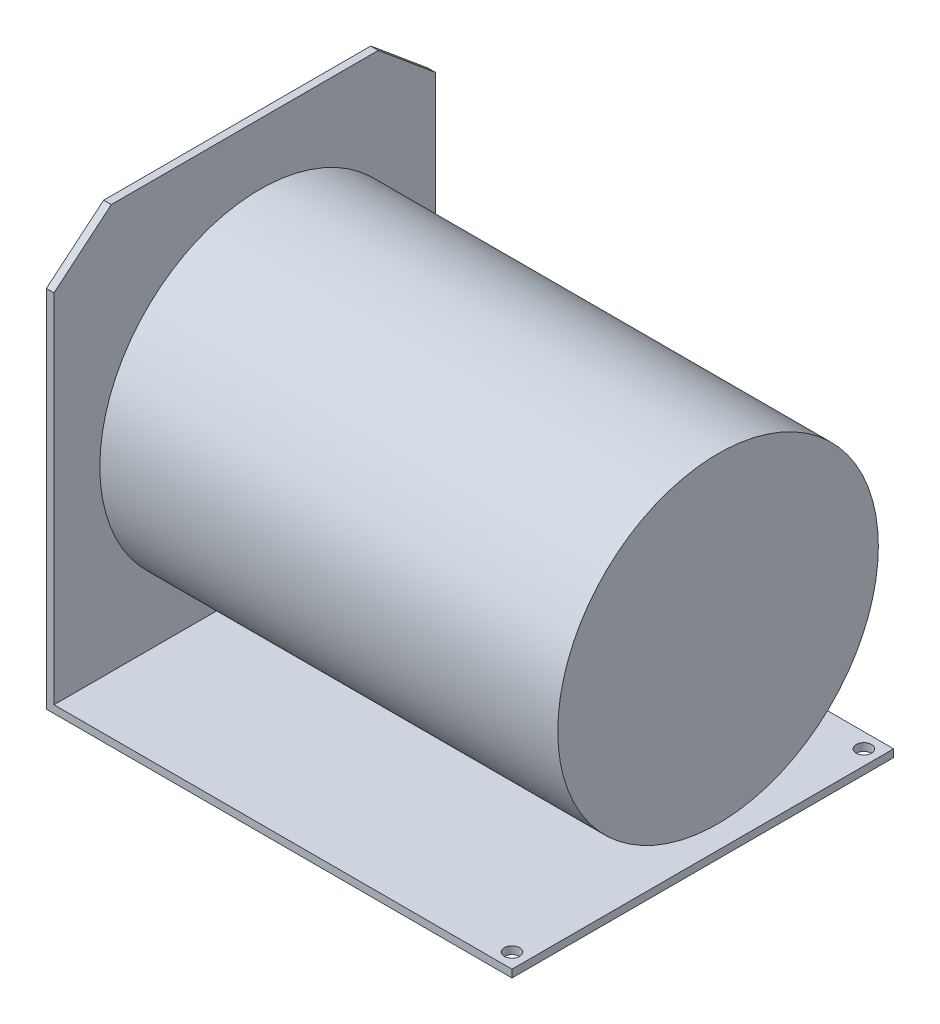
ISO-10303-21;
HEADER;
FILE_DESCRIPTION(('STEP AP214'),'2;1');
FILE_NAME('part.step','',(''),(''),'','','');
FILE_SCHEMA(('AUTOMOTIVE_DESIGN { 1 0 10303 214 1 1 1 1 }'));
ENDSEC;
DATA;
#1=APPLICATION_CONTEXT('core data for automotive mechanical design processes');
#2=APPLICATION_PROTOCOL_DEFINITION('international standard','automotive_design',2000,#1);
#3=PRODUCT_CONTEXT('',#1,'mechanical');
#4=PRODUCT('Part','Part','',(#3));
#5=PRODUCT_RELATED_PRODUCT_CATEGORY('part','',(#4));
#6=PRODUCT_DEFINITION_FORMATION('','',#4);
#7=PRODUCT_DEFINITION_CONTEXT('part definition',#1,'design');
#8=PRODUCT_DEFINITION('design','',#6,#7);
#9=PRODUCT_DEFINITION_SHAPE('','',#8);
#10=(LENGTH_UNIT() NAMED_UNIT(*) SI_UNIT(.MILLI.,.METRE.));
#11=(NAMED_UNIT(*) PLANE_ANGLE_UNIT() SI_UNIT($,.RADIAN.));
#12=(NAMED_UNIT(*) SI_UNIT($,.STERADIAN.) SOLID_ANGLE_UNIT());
#13=UNCERTAINTY_MEASURE_WITH_UNIT(LENGTH_MEASURE(1.E-05),#10,'distance_accuracy_value','');
#14=(GEOMETRIC_REPRESENTATION_CONTEXT(3) GLOBAL_UNCERTAINTY_ASSIGNED_CONTEXT((#13)) GLOBAL_UNIT_ASSIGNED_CONTEXT((#10,
#11,#12)) REPRESENTATION_CONTEXT('',''));
#15=CARTESIAN_POINT('',(0.,0.,0.));
#16=DIRECTION('',(0.,0.,1.));
#17=DIRECTION('',(1.,0.,0.));
#18=AXIS2_PLACEMENT_3D('',#15,#16,#17);
#19=CARTESIAN_POINT('',(-1.,0.,0.));
#20=DIRECTION('',(-1.,0.,0.));
#21=DIRECTION('',(0.,0.,1.));
#22=AXIS2_PLACEMENT_3D('',#19,#20,#21);
#23=PLANE('',#22);
#24=DIRECTION('',(0.,-0.640103799439423,-0.768288439287756));
#25=VECTOR('',#24,1.);
#26=CARTESIAN_POINT('',(-1.,12.2697683463885,-10.2226259502822));
#27=LINE('',#26,#25);
#28=CARTESIAN_POINT('',(-1.,13.5,-8.74603300091481));
#29=VERTEX_POINT('',#28);
#30=CARTESIAN_POINT('',(-1.,10.3723614514982,-12.5));
#31=VERTEX_POINT('',#30);
#32=EDGE_CURVE('E129',#29,#31,#27,.T.);
#33=ORIENTED_EDGE('',*,*,#32,.F.);
#34=DIRECTION('',(0.,0.,-1.));
#35=VECTOR('',#34,1.);
#36=CARTESIAN_POINT('',(-1.,13.5,-12.5));
#37=LINE('',#36,#35);
#38=CARTESIAN_POINT('',(-1.,13.5,8.74603300091481));
#39=VERTEX_POINT('',#38);
#40=EDGE_CURVE('E128',#39,#29,#37,.T.);
#41=ORIENTED_EDGE('',*,*,#40,.F.);
#42=DIRECTION('',(0.,-0.640103799439423,0.768288439287756));
#43=VECTOR('',#42,1.);
#44=CARTESIAN_POINT('',(-1.,12.2697683463885,10.2226259502822));
#45=LINE('',#44,#43);
#46=CARTESIAN_POINT('',(-1.,10.3723614514982,12.5));
#47=VERTEX_POINT('',#46);
#48=EDGE_CURVE('E193',#39,#47,#45,.T.);
#49=ORIENTED_EDGE('',*,*,#48,.T.);
#50=DIRECTION('',(0.,1.,0.));
#51=VECTOR('',#50,1.);
#52=CARTESIAN_POINT('',(-1.,13.5,12.5));
#53=LINE('',#52,#51);
#54=CARTESIAN_POINT('',(-1.,-13.,12.5));
#55=VERTEX_POINT('',#54);
#56=EDGE_CURVE('E144',#55,#47,#53,.T.);
#57=ORIENTED_EDGE('',*,*,#56,.F.);
#58=DIRECTION('',(0.,0.,1.));
#59=VECTOR('',#58,1.);
#60=CARTESIAN_POINT('',(-1.,-13.,12.5));
#61=LINE('',#60,#59);
#62=CARTESIAN_POINT('',(-1.,-13.,-12.5));
#63=VERTEX_POINT('',#62);
#64=EDGE_CURVE('E152',#63,#55,#61,.T.);
#65=ORIENTED_EDGE('',*,*,#64,.F.);
#66=DIRECTION('',(0.,-1.,0.));
#67=VECTOR('',#66,1.);
#68=CARTESIAN_POINT('',(-1.,13.5,-12.5));
#69=LINE('',#68,#67);
#70=EDGE_CURVE('E139',#31,#63,#69,.T.);
#71=ORIENTED_EDGE('',*,*,#70,.F.);
#72=EDGE_LOOP('',(#33,#41,#49,#57,#65,#71));
#73=FACE_BOUND('',#72,.T.);
#74=ADVANCED_FACE('F49',(#73),#23,.F.);
#75=CARTESIAN_POINT('',(-1.5,13.5,-12.5));
#76=DIRECTION('',(0.,-1.,0.));
#77=DIRECTION('',(0.,0.,-1.));
#78=AXIS2_PLACEMENT_3D('',#75,#76,#77);
#79=PLANE('',#78);
#80=DIRECTION('',(-1.,0.,0.));
#81=VECTOR('',#80,1.);
#82=CARTESIAN_POINT('',(28.5,13.5,-8.74603300091481));
#83=LINE('',#82,#81);
#84=CARTESIAN_POINT('',(-1.5,13.5,-8.74603300091481));
#85=VERTEX_POINT('',#84);
#86=EDGE_CURVE('E115',#29,#85,#83,.T.);
#87=ORIENTED_EDGE('',*,*,#86,.T.);
#88=DIRECTION('',(0.,0.,-1.));
#89=VECTOR('',#88,1.);
#90=CARTESIAN_POINT('',(-1.5,13.5,-12.5));
#91=LINE('',#90,#89);
#92=CARTESIAN_POINT('',(-1.5,13.5,8.7460330009148));
#93=VERTEX_POINT('',#92);
#94=EDGE_CURVE('E126',#93,#85,#91,.T.);
#95=ORIENTED_EDGE('',*,*,#94,.F.);
#96=DIRECTION('',(-1.,0.,0.));
#97=VECTOR('',#96,1.);
#98=CARTESIAN_POINT('',(28.5,13.5,8.74603300091481));
#99=LINE('',#98,#97);
#100=EDGE_CURVE('E74',#39,#93,#99,.T.);
#101=ORIENTED_EDGE('',*,*,#100,.F.);
#102=ORIENTED_EDGE('',*,*,#40,.T.);
#103=EDGE_LOOP('',(#87,#95,#101,#102));
#104=FACE_BOUND('',#103,.T.);
#105=ADVANCED_FACE('F125',(#104),#79,.F.);
#106=CARTESIAN_POINT('',(-1.5,13.5,-12.5));
#107=DIRECTION('',(0.,0.,1.));
#108=DIRECTION('',(0.,-1.,0.));
#109=AXIS2_PLACEMENT_3D('',#106,#107,#108);
#110=PLANE('',#109);
#111=DIRECTION('',(-1.,0.,0.));
#112=VECTOR('',#111,1.);
#113=CARTESIAN_POINT('',(28.5,10.3723614514982,-12.5));
#114=LINE('',#113,#112);
#115=CARTESIAN_POINT('',(-1.5,10.3723614514982,-12.5));
#116=VERTEX_POINT('',#115);
#117=EDGE_CURVE('E66',#31,#116,#114,.T.);
#118=ORIENTED_EDGE('',*,*,#117,.F.);
#119=ORIENTED_EDGE('',*,*,#70,.T.);
#120=DIRECTION('',(-1.,0.,0.));
#121=VECTOR('',#120,1.);
#122=CARTESIAN_POINT('',(29.,-13.,-12.5));
#123=LINE('',#122,#121);
#124=CARTESIAN_POINT('',(29.,-13.,-12.5));
#125=VERTEX_POINT('',#124);
#126=EDGE_CURVE('E147',#125,#63,#123,.T.);
#127=ORIENTED_EDGE('',*,*,#126,.F.);
#128=DIRECTION('',(0.,1.,0.));
#129=VECTOR('',#128,1.);
#130=CARTESIAN_POINT('',(29.,-13.5,-12.5));
#131=LINE('',#130,#129);
#132=CARTESIAN_POINT('',(29.,-13.5,-12.5));
#133=VERTEX_POINT('',#132);
#134=EDGE_CURVE('E173',#133,#125,#131,.T.);
#135=ORIENTED_EDGE('',*,*,#134,.F.);
#136=DIRECTION('',(1.,0.,0.));
#137=VECTOR('',#136,1.);
#138=CARTESIAN_POINT('',(-1.5,-13.5,-12.5));
#139=LINE('',#138,#137);
#140=CARTESIAN_POINT('',(-1.5,-13.5,-12.5));
#141=VERTEX_POINT('',#140);
#142=EDGE_CURVE('E12',#141,#133,#139,.T.);
#143=ORIENTED_EDGE('',*,*,#142,.F.);
#144=DIRECTION('',(0.,-1.,0.));
#145=VECTOR('',#144,1.);
#146=CARTESIAN_POINT('',(-1.5,13.5,-12.5));
#147=LINE('',#146,#145);
#148=EDGE_CURVE('E134',#116,#141,#147,.T.);
#149=ORIENTED_EDGE('',*,*,#148,.F.);
#150=EDGE_LOOP('',(#118,#119,#127,#135,#143,#149));
#151=FACE_BOUND('',#150,.T.);
#152=ADVANCED_FACE('F188',(#151),#110,.F.);
#153=CARTESIAN_POINT('',(-1.5,0.,0.));
#154=DIRECTION('',(-1.,0.,0.));
#155=DIRECTION('',(0.,0.,1.));
#156=AXIS2_PLACEMENT_3D('',#153,#154,#155);
#157=PLANE('',#156);
#158=CARTESIAN_POINT('',(-1.5,0.,0.));
#159=DIRECTION('',(-1.,0.,0.));
#160=DIRECTION('',(0.,0.,1.));
#161=AXIS2_PLACEMENT_3D('',#158,#159,#160);
#162=CIRCLE('',#161,1.);
#163=CARTESIAN_POINT('',(-1.5,0.,1.));
#164=VERTEX_POINT('',#163);
#165=EDGE_CURVE('E254',#164,#164,#162,.T.);
#166=ORIENTED_EDGE('',*,*,#165,.F.);
#167=EDGE_LOOP('',(#166));
#168=FACE_BOUND('',#167,.T.);
#169=ORIENTED_EDGE('',*,*,#94,.T.);
#170=DIRECTION('',(0.,-0.640103799439422,-0.768288439287756));
#171=VECTOR('',#170,1.);
#172=CARTESIAN_POINT('',(-1.5,13.5,-8.74603300091481));
#173=LINE('',#172,#171);
#174=EDGE_CURVE('E112',#85,#116,#173,.T.);
#175=ORIENTED_EDGE('',*,*,#174,.T.);
#176=ORIENTED_EDGE('',*,*,#148,.T.);
#177=DIRECTION('',(0.,0.,1.));
#178=VECTOR('',#177,1.);
#179=CARTESIAN_POINT('',(-1.5,-13.5,-12.5));
#180=LINE('',#179,#178);
#181=CARTESIAN_POINT('',(-1.5,-13.5,12.5));
#182=VERTEX_POINT('',#181);
#183=EDGE_CURVE('E137',#141,#182,#180,.T.);
#184=ORIENTED_EDGE('',*,*,#183,.T.);
#185=DIRECTION('',(0.,1.,0.));
#186=VECTOR('',#185,1.);
#187=CARTESIAN_POINT('',(-1.5,13.5,12.5));
#188=LINE('',#187,#186);
#189=CARTESIAN_POINT('',(-1.5,10.3723614514982,12.5));
#190=VERTEX_POINT('',#189);
#191=EDGE_CURVE('E135',#182,#190,#188,.T.);
#192=ORIENTED_EDGE('',*,*,#191,.T.);
#193=DIRECTION('',(0.,-0.640103799439422,0.768288439287756));
#194=VECTOR('',#193,1.);
#195=CARTESIAN_POINT('',(-1.5,13.5,8.74603300091481));
#196=LINE('',#195,#194);
#197=EDGE_CURVE('E133',#93,#190,#196,.T.);
#198=ORIENTED_EDGE('',*,*,#197,.F.);
#199=EDGE_LOOP('',(#169,#175,#176,#184,#192,#198));
#200=FACE_BOUND('',#199,.T.);
#201=ADVANCED_FACE('F131',(#168,#200),#157,.T.);
#202=CARTESIAN_POINT('',(-1.5,13.5,12.5));
#203=DIRECTION('',(0.,0.,-1.));
#204=DIRECTION('',(0.,1.,0.));
#205=AXIS2_PLACEMENT_3D('',#202,#203,#204);
#206=PLANE('',#205);
#207=ORIENTED_EDGE('',*,*,#56,.T.);
#208=DIRECTION('',(-1.,0.,0.));
#209=VECTOR('',#208,1.);
#210=CARTESIAN_POINT('',(28.5,10.3723614514982,12.5));
#211=LINE('',#210,#209);
#212=EDGE_CURVE('E197',#47,#190,#211,.T.);
#213=ORIENTED_EDGE('',*,*,#212,.T.);
#214=ORIENTED_EDGE('',*,*,#191,.F.);
#215=DIRECTION('',(1.,0.,0.));
#216=VECTOR('',#215,1.);
#217=CARTESIAN_POINT('',(-1.5,-13.5,12.5));
#218=LINE('',#217,#216);
#219=CARTESIAN_POINT('',(29.,-13.5,12.5));
#220=VERTEX_POINT('',#219);
#221=EDGE_CURVE('E58',#182,#220,#218,.T.);
#222=ORIENTED_EDGE('',*,*,#221,.T.);
#223=DIRECTION('',(0.,-1.,0.));
#224=VECTOR('',#223,1.);
#225=CARTESIAN_POINT('',(29.,-13.5,12.5));
#226=LINE('',#225,#224);
#227=CARTESIAN_POINT('',(29.,-13.,12.5));
#228=VERTEX_POINT('',#227);
#229=EDGE_CURVE('E157',#228,#220,#226,.T.);
#230=ORIENTED_EDGE('',*,*,#229,.F.);
#231=DIRECTION('',(-1.,0.,0.));
#232=VECTOR('',#231,1.);
#233=CARTESIAN_POINT('',(29.,-13.,12.5));
#234=LINE('',#233,#232);
#235=EDGE_CURVE('E176',#228,#55,#234,.T.);
#236=ORIENTED_EDGE('',*,*,#235,.T.);
#237=EDGE_LOOP('',(#207,#213,#214,#222,#230,#236));
#238=FACE_BOUND('',#237,.T.);
#239=ADVANCED_FACE('F51',(#238),#206,.F.);
#240=CARTESIAN_POINT('',(-1.5,-13.5,-12.5));
#241=DIRECTION('',(0.,1.,0.));
#242=DIRECTION('',(0.,0.,1.));
#243=AXIS2_PLACEMENT_3D('',#240,#241,#242);
#244=PLANE('',#243);
#245=CARTESIAN_POINT('',(28.0280498638905,-13.5,-11.5259972458375));
#246=DIRECTION('',(0.,1.,0.));
#247=DIRECTION('',(0.,0.,1.));
#248=AXIS2_PLACEMENT_3D('',#245,#246,#247);
#249=CIRCLE('',#248,0.499999999999999);
#250=CARTESIAN_POINT('',(28.0280498638905,-13.5,-11.0259972458375));
#251=VERTEX_POINT('',#250);
#252=EDGE_CURVE('E164',#251,#251,#249,.T.);
#253=ORIENTED_EDGE('',*,*,#252,.T.);
#254=EDGE_LOOP('',(#253));
#255=FACE_BOUND('',#254,.T.);
#256=CARTESIAN_POINT('',(28.0280498638905,-13.5,11.5259972458375));
#257=DIRECTION('',(0.,-1.,0.));
#258=DIRECTION('',(0.,0.,-1.));
#259=AXIS2_PLACEMENT_3D('',#256,#257,#258);
#260=CIRCLE('',#259,0.499999999999999);
#261=CARTESIAN_POINT('',(28.0280498638905,-13.5,11.0259972458375));
#262=VERTEX_POINT('',#261);
#263=EDGE_CURVE('E153',#262,#262,#260,.T.);
#264=ORIENTED_EDGE('',*,*,#263,.F.);
#265=EDGE_LOOP('',(#264));
#266=FACE_BOUND('',#265,.T.);
#267=ORIENTED_EDGE('',*,*,#142,.T.);
#268=DIRECTION('',(0.,0.,-1.));
#269=VECTOR('',#268,1.);
#270=CARTESIAN_POINT('',(29.,-13.5,12.5));
#271=LINE('',#270,#269);
#272=EDGE_CURVE('E170',#220,#133,#271,.T.);
#273=ORIENTED_EDGE('',*,*,#272,.F.);
#274=ORIENTED_EDGE('',*,*,#221,.F.);
#275=ORIENTED_EDGE('',*,*,#183,.F.);
#276=EDGE_LOOP('',(#267,#273,#274,#275));
#277=FACE_BOUND('',#276,.T.);
#278=ADVANCED_FACE('F204',(#255,#266,#277),#244,.F.);
#279=CARTESIAN_POINT('',(29.,-13.,12.5));
#280=DIRECTION('',(0.,-1.,0.));
#281=DIRECTION('',(0.,0.,-1.));
#282=AXIS2_PLACEMENT_3D('',#279,#280,#281);
#283=PLANE('',#282);
#284=CARTESIAN_POINT('',(28.0280498638905,-13.,-11.5259972458375));
#285=DIRECTION('',(0.,-1.,0.));
#286=DIRECTION('',(0.,0.,-1.));
#287=AXIS2_PLACEMENT_3D('',#284,#285,#286);
#288=CIRCLE('',#287,0.499999999999999);
#289=CARTESIAN_POINT('',(28.0280498638905,-13.,-12.0259972458375));
#290=VERTEX_POINT('',#289);
#291=EDGE_CURVE('E53',#290,#290,#288,.F.);
#292=ORIENTED_EDGE('',*,*,#291,.F.);
#293=EDGE_LOOP('',(#292));
#294=FACE_BOUND('',#293,.T.);
#295=CARTESIAN_POINT('',(28.0280498638905,-13.,11.5259972458375));
#296=DIRECTION('',(0.,-1.,0.));
#297=DIRECTION('',(0.,0.,-1.));
#298=AXIS2_PLACEMENT_3D('',#295,#296,#297);
#299=CIRCLE('',#298,0.499999999999999);
#300=CARTESIAN_POINT('',(28.0280498638905,-13.,11.0259972458375));
#301=VERTEX_POINT('',#300);
#302=EDGE_CURVE('E150',#301,#301,#299,.T.);
#303=ORIENTED_EDGE('',*,*,#302,.T.);
#304=EDGE_LOOP('',(#303));
#305=FACE_BOUND('',#304,.T.);
#306=ORIENTED_EDGE('',*,*,#64,.T.);
#307=ORIENTED_EDGE('',*,*,#235,.F.);
#308=DIRECTION('',(0.,0.,1.));
#309=VECTOR('',#308,1.);
#310=CARTESIAN_POINT('',(29.,-13.,12.5));
#311=LINE('',#310,#309);
#312=EDGE_CURVE('E175',#125,#228,#311,.T.);
#313=ORIENTED_EDGE('',*,*,#312,.F.);
#314=ORIENTED_EDGE('',*,*,#126,.T.);
#315=EDGE_LOOP('',(#306,#307,#313,#314));
#316=FACE_BOUND('',#315,.T.);
#317=ADVANCED_FACE('F183',(#294,#305,#316),#283,.F.);
#318=CARTESIAN_POINT('',(29.,0.,0.));
#319=DIRECTION('',(-1.,0.,0.));
#320=DIRECTION('',(0.,0.,1.));
#321=AXIS2_PLACEMENT_3D('',#318,#319,#320);
#322=PLANE('',#321);
#323=ORIENTED_EDGE('',*,*,#229,.T.);
#324=ORIENTED_EDGE('',*,*,#272,.T.);
#325=ORIENTED_EDGE('',*,*,#134,.T.);
#326=ORIENTED_EDGE('',*,*,#312,.T.);
#327=EDGE_LOOP('',(#323,#324,#325,#326));
#328=FACE_BOUND('',#327,.T.);
#329=ADVANCED_FACE('F202',(#328),#322,.F.);
#330=CARTESIAN_POINT('',(28.0280498638905,16.5,11.5259972458375));
#331=DIRECTION('',(0.,-1.,0.));
#332=DIRECTION('',(0.,0.,-1.));
#333=AXIS2_PLACEMENT_3D('',#330,#331,#332);
#334=CYLINDRICAL_SURFACE('',#333,0.499999999999999);
#335=ORIENTED_EDGE('',*,*,#263,.T.);
#336=EDGE_LOOP('',(#335));
#337=FACE_BOUND('',#336,.T.);
#338=ORIENTED_EDGE('',*,*,#302,.F.);
#339=EDGE_LOOP('',(#338));
#340=FACE_BOUND('',#339,.T.);
#341=ADVANCED_FACE('F231',(#337,#340),#334,.F.);
#342=CARTESIAN_POINT('',(28.0280498638905,16.5,-11.5259972458375));
#343=DIRECTION('',(0.,-1.,0.));
#344=DIRECTION('',(0.,0.,-1.));
#345=AXIS2_PLACEMENT_3D('',#342,#343,#344);
#346=CYLINDRICAL_SURFACE('',#345,0.499999999999999);
#347=ORIENTED_EDGE('',*,*,#252,.F.);
#348=EDGE_LOOP('',(#347));
#349=FACE_BOUND('',#348,.T.);
#350=ORIENTED_EDGE('',*,*,#291,.T.);
#351=EDGE_LOOP('',(#350));
#352=FACE_BOUND('',#351,.T.);
#353=ADVANCED_FACE('F234',(#349,#352),#346,.F.);
#354=CARTESIAN_POINT('',(28.5,13.5,8.74603300091481));
#355=DIRECTION('',(0.,-0.768288439287756,-0.640103799439422));
#356=DIRECTION('',(0.,0.640103799439423,-0.768288439287756));
#357=AXIS2_PLACEMENT_3D('',#354,#355,#356);
#358=PLANE('',#357);
#359=ORIENTED_EDGE('',*,*,#100,.T.);
#360=ORIENTED_EDGE('',*,*,#197,.T.);
#361=ORIENTED_EDGE('',*,*,#212,.F.);
#362=ORIENTED_EDGE('',*,*,#48,.F.);
#363=EDGE_LOOP('',(#359,#360,#361,#362));
#364=FACE_BOUND('',#363,.T.);
#365=ADVANCED_FACE('F237',(#364),#358,.F.);
#366=CARTESIAN_POINT('',(28.5,13.5,-8.74603300091481));
#367=DIRECTION('',(0.,0.768288439287756,-0.640103799439422));
#368=DIRECTION('',(0.,0.640103799439423,0.768288439287756));
#369=AXIS2_PLACEMENT_3D('',#366,#367,#368);
#370=PLANE('',#369);
#371=ORIENTED_EDGE('',*,*,#32,.T.);
#372=ORIENTED_EDGE('',*,*,#117,.T.);
#373=ORIENTED_EDGE('',*,*,#174,.F.);
#374=ORIENTED_EDGE('',*,*,#86,.F.);
#375=EDGE_LOOP('',(#371,#372,#373,#374));
#376=FACE_BOUND('',#375,.T.);
#377=ADVANCED_FACE('F114',(#376),#370,.T.);
#378=CARTESIAN_POINT('',(-9.5,0.,0.));
#379=DIRECTION('',(1.,0.,0.));
#380=DIRECTION('',(0.,0.,-1.));
#381=AXIS2_PLACEMENT_3D('',#378,#379,#380);
#382=CYLINDRICAL_SURFACE('',#381,1.);
#383=CARTESIAN_POINT('',(-9.5,0.,0.));
#384=DIRECTION('',(-1.,0.,0.));
#385=DIRECTION('',(0.,0.,1.));
#386=AXIS2_PLACEMENT_3D('',#383,#384,#385);
#387=CIRCLE('',#386,1.);
#388=CARTESIAN_POINT('',(-9.5,0.,1.));
#389=VERTEX_POINT('',#388);
#390=EDGE_CURVE('E120',#389,#389,#387,.T.);
#391=ORIENTED_EDGE('',*,*,#390,.F.);
#392=EDGE_LOOP('',(#391));
#393=FACE_BOUND('',#392,.T.);
#394=ORIENTED_EDGE('',*,*,#165,.T.);
#395=EDGE_LOOP('',(#394));
#396=FACE_BOUND('',#395,.T.);
#397=ADVANCED_FACE('F243',(#393,#396),#382,.T.);
#398=CARTESIAN_POINT('',(-9.5,0.,0.));
#399=DIRECTION('',(-1.,0.,0.));
#400=DIRECTION('',(0.,0.,1.));
#401=AXIS2_PLACEMENT_3D('',#398,#399,#400);
#402=PLANE('',#401);
#403=ORIENTED_EDGE('',*,*,#390,.T.);
#404=EDGE_LOOP('',(#403));
#405=FACE_BOUND('',#404,.T.);
#406=ADVANCED_FACE('F246',(#405),#402,.T.);
#407=CLOSED_SHELL('',(#74,#105,#152,#201,#239,#278,#317,#329,#341,#353,#365,#377,#397,#406));
#408=MANIFOLD_SOLID_BREP('B2',#407);
#409=CARTESIAN_POINT('',(30.,0.,0.));
#410=DIRECTION('',(-1.,0.,0.));
#411=DIRECTION('',(0.,0.,1.));
#412=AXIS2_PLACEMENT_3D('',#409,#410,#411);
#413=CYLINDRICAL_SURFACE('',#412,10.5);
#414=CARTESIAN_POINT('',(30.,0.,0.));
#415=DIRECTION('',(1.,0.,0.));
#416=DIRECTION('',(0.,0.,-1.));
#417=AXIS2_PLACEMENT_3D('',#414,#415,#416);
#418=CIRCLE('',#417,10.5);
#419=CARTESIAN_POINT('',(30.,0.,-10.5));
#420=VERTEX_POINT('',#419);
#421=EDGE_CURVE('E367',#420,#420,#418,.T.);
#422=ORIENTED_EDGE('',*,*,#421,.F.);
#423=EDGE_LOOP('',(#422));
#424=FACE_BOUND('',#423,.T.);
#425=CARTESIAN_POINT('',(0.,0.,0.));
#426=DIRECTION('',(1.,0.,0.));
#427=DIRECTION('',(0.,0.,-1.));
#428=AXIS2_PLACEMENT_3D('',#425,#426,#427);
#429=CIRCLE('',#428,10.5);
#430=CARTESIAN_POINT('',(0.,0.,-10.5));
#431=VERTEX_POINT('',#430);
#432=EDGE_CURVE('E362',#431,#431,#429,.T.);
#433=ORIENTED_EDGE('',*,*,#432,.T.);
#434=EDGE_LOOP('',(#433));
#435=FACE_BOUND('',#434,.T.);
#436=ADVANCED_FACE('F359',(#424,#435),#413,.T.);
#437=CARTESIAN_POINT('',(30.,0.,0.));
#438=DIRECTION('',(1.,0.,0.));
#439=DIRECTION('',(0.,0.,-1.));
#440=AXIS2_PLACEMENT_3D('',#437,#438,#439);
#441=PLANE('',#440);
#442=ORIENTED_EDGE('',*,*,#421,.T.);
#443=EDGE_LOOP('',(#442));
#444=FACE_BOUND('',#443,.T.);
#445=ADVANCED_FACE('F387',(#444),#441,.T.);
#446=CARTESIAN_POINT('',(0.,0.,0.));
#447=DIRECTION('',(1.,0.,0.));
#448=DIRECTION('',(0.,0.,-1.));
#449=AXIS2_PLACEMENT_3D('',#446,#447,#448);
#450=PLANE('',#449);
#451=CARTESIAN_POINT('',(0.,0.,0.));
#452=DIRECTION('',(-1.,0.,0.));
#453=DIRECTION('',(0.,0.,1.));
#454=AXIS2_PLACEMENT_3D('',#451,#452,#453);
#455=CIRCLE('',#454,6.);
#456=CARTESIAN_POINT('',(0.,0.,6.));
#457=VERTEX_POINT('',#456);
#458=EDGE_CURVE('E48',#457,#457,#455,.T.);
#459=ORIENTED_EDGE('',*,*,#458,.F.);
#460=EDGE_LOOP('',(#459));
#461=FACE_BOUND('',#460,.T.);
#462=ORIENTED_EDGE('',*,*,#432,.F.);
#463=EDGE_LOOP('',(#462));
#464=FACE_BOUND('',#463,.T.);
#465=ADVANCED_FACE('F384',(#461,#464),#450,.F.);
#466=CARTESIAN_POINT('',(-1.,0.,0.));
#467=DIRECTION('',(1.,0.,0.));
#468=DIRECTION('',(0.,0.,-1.));
#469=AXIS2_PLACEMENT_3D('',#466,#467,#468);
#470=CYLINDRICAL_SURFACE('',#469,6.);
#471=CARTESIAN_POINT('',(-1.,0.,0.));
#472=DIRECTION('',(-1.,0.,0.));
#473=DIRECTION('',(0.,0.,1.));
#474=AXIS2_PLACEMENT_3D('',#471,#472,#473);
#475=CIRCLE('',#474,6.);
#476=CARTESIAN_POINT('',(-1.,0.,6.));
#477=VERTEX_POINT('',#476);
#478=EDGE_CURVE('E374',#477,#477,#475,.T.);
#479=ORIENTED_EDGE('',*,*,#478,.F.);
#480=EDGE_LOOP('',(#479));
#481=FACE_BOUND('',#480,.T.);
#482=ORIENTED_EDGE('',*,*,#458,.T.);
#483=EDGE_LOOP('',(#482));
#484=FACE_BOUND('',#483,.T.);
#485=ADVANCED_FACE('F386',(#481,#484),#470,.T.);
#486=CARTESIAN_POINT('',(-1.,0.,0.));
#487=DIRECTION('',(-1.,0.,0.));
#488=DIRECTION('',(0.,0.,1.));
#489=AXIS2_PLACEMENT_3D('',#486,#487,#488);
#490=PLANE('',#489);
#491=ORIENTED_EDGE('',*,*,#478,.T.);
#492=EDGE_LOOP('',(#491));
#493=FACE_BOUND('',#492,.T.);
#494=ADVANCED_FACE('F393',(#493),#490,.T.);
#495=CLOSED_SHELL('',(#436,#445,#465,#485,#494));
#496=MANIFOLD_SOLID_BREP('B6',#495);
#497=ADVANCED_BREP_SHAPE_REPRESENTATION('',(#18,#408,#496),#14);
#498=SHAPE_DEFINITION_REPRESENTATION(#9,#497);
ENDSEC;
END-ISO-10303-21;
